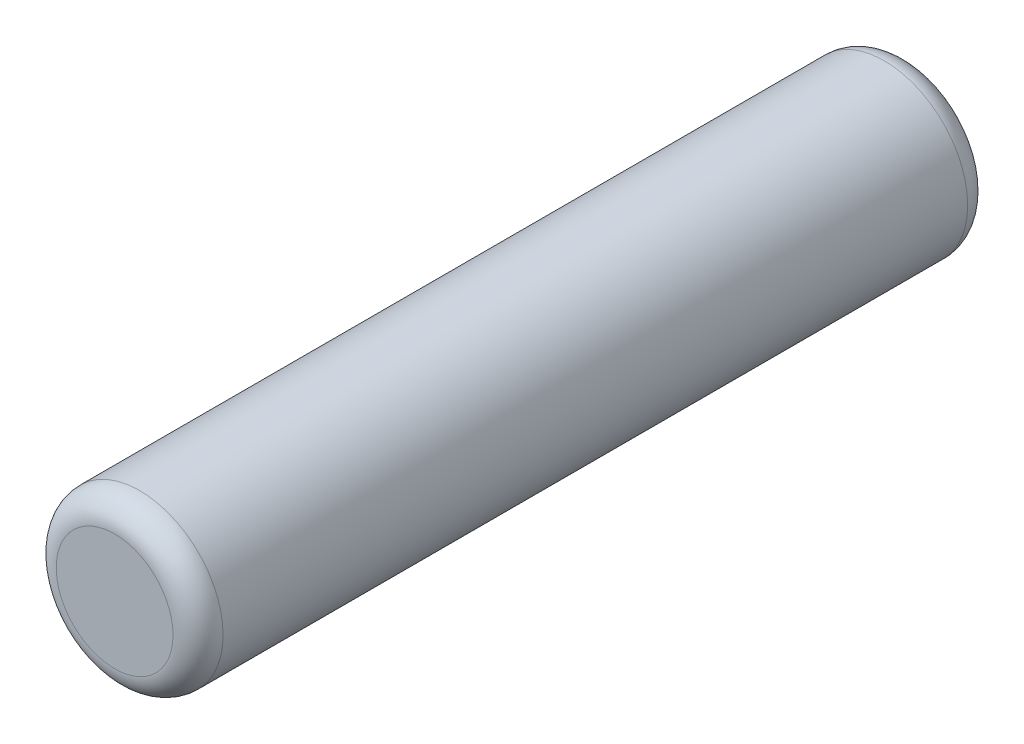
ISO-10303-21;
HEADER;
FILE_DESCRIPTION(('STEP AP214'),'2;1');
FILE_NAME('part.step','',(''),(''),'','','');
FILE_SCHEMA(('AUTOMOTIVE_DESIGN { 1 0 10303 214 1 1 1 1 }'));
ENDSEC;
DATA;
#1=APPLICATION_CONTEXT('core data for automotive mechanical design processes');
#2=APPLICATION_PROTOCOL_DEFINITION('international standard','automotive_design',2000,#1);
#3=PRODUCT_CONTEXT('',#1,'mechanical');
#4=PRODUCT('Part','Part','',(#3));
#5=PRODUCT_RELATED_PRODUCT_CATEGORY('part','',(#4));
#6=PRODUCT_DEFINITION_FORMATION('','',#4);
#7=PRODUCT_DEFINITION_CONTEXT('part definition',#1,'design');
#8=PRODUCT_DEFINITION('design','',#6,#7);
#9=PRODUCT_DEFINITION_SHAPE('','',#8);
#10=(LENGTH_UNIT() NAMED_UNIT(*) SI_UNIT(.MILLI.,.METRE.));
#11=(NAMED_UNIT(*) PLANE_ANGLE_UNIT() SI_UNIT($,.RADIAN.));
#12=(NAMED_UNIT(*) SI_UNIT($,.STERADIAN.) SOLID_ANGLE_UNIT());
#13=UNCERTAINTY_MEASURE_WITH_UNIT(LENGTH_MEASURE(1.E-05),#10,'distance_accuracy_value','');
#14=(GEOMETRIC_REPRESENTATION_CONTEXT(3) GLOBAL_UNCERTAINTY_ASSIGNED_CONTEXT((#13)) GLOBAL_UNIT_ASSIGNED_CONTEXT((#10,
#11,#12)) REPRESENTATION_CONTEXT('',''));
#15=CARTESIAN_POINT('',(0.,0.,0.));
#16=DIRECTION('',(0.,0.,1.));
#17=DIRECTION('',(1.,0.,0.));
#18=AXIS2_PLACEMENT_3D('',#15,#16,#17);
#19=CARTESIAN_POINT('',(0.,0.,-4.7625));
#20=DIRECTION('',(0.,0.,1.));
#21=DIRECTION('',(1.,0.,0.));
#22=AXIS2_PLACEMENT_3D('',#19,#20,#21);
#23=PLANE('',#22);
#24=CARTESIAN_POINT('',(0.,0.,-4.7625));
#25=DIRECTION('',(0.,0.,1.));
#26=DIRECTION('',(0.,-1.,0.));
#27=AXIS2_PLACEMENT_3D('',#24,#25,#26);
#28=CIRCLE('',#27,0.700000000000001);
#29=CARTESIAN_POINT('',(0.,-0.700000000000002,-4.7625));
#30=VERTEX_POINT('',#29);
#31=EDGE_CURVE('E36',#30,#30,#28,.T.);
#32=ORIENTED_EDGE('',*,*,#31,.F.);
#33=EDGE_LOOP('',(#32));
#34=FACE_BOUND('',#33,.T.);
#35=ADVANCED_FACE('F16',(#34),#23,.F.);
#36=CARTESIAN_POINT('',(0.,0.,4.7625));
#37=DIRECTION('',(0.,0.,1.));
#38=DIRECTION('',(1.,0.,0.));
#39=AXIS2_PLACEMENT_3D('',#36,#37,#38);
#40=PLANE('',#39);
#41=DIRECTION('',(0.0083225900761891,0.999965366647477,0.));
#42=VECTOR('',#41,1.);
#43=CARTESIAN_POINT('',(0.699909560659538,-0.0108663537933372,4.7625));
#44=LINE('',#43,#42);
#45=CARTESIAN_POINT('',(0.699912606396434,-0.0108664056507162,4.7625));
#46=VERTEX_POINT('',#45);
#47=CARTESIAN_POINT('',(0.7,0.,4.7625));
#48=VERTEX_POINT('',#47);
#49=EDGE_CURVE('E20',#46,#48,#44,.T.);
#50=ORIENTED_EDGE('',*,*,#49,.T.);
#51=CARTESIAN_POINT('',(0.,0.,4.7625));
#52=DIRECTION('',(0.,0.,1.));
#53=DIRECTION('',(1.,0.,0.));
#54=AXIS2_PLACEMENT_3D('',#51,#52,#53);
#55=CIRCLE('',#54,0.7);
#56=EDGE_CURVE('E32',#46,#48,#55,.F.);
#57=ORIENTED_EDGE('',*,*,#56,.F.);
#58=EDGE_LOOP('',(#50,#57));
#59=FACE_BOUND('',#58,.T.);
#60=ADVANCED_FACE('F34',(#59),#40,.T.);
#61=CARTESIAN_POINT('',(0.,0.,-4.4625));
#62=DIRECTION('',(0.,0.,1.));
#63=DIRECTION('',(0.,-1.,0.));
#64=AXIS2_PLACEMENT_3D('',#61,#62,#63);
#65=TOROIDAL_SURFACE('',#64,0.700000000000001,0.3);
#66=ORIENTED_EDGE('',*,*,#31,.T.);
#67=EDGE_LOOP('',(#66));
#68=FACE_BOUND('',#67,.T.);
#69=CARTESIAN_POINT('',(0.,0.,-4.4625));
#70=DIRECTION('',(0.,0.,1.));
#71=DIRECTION('',(1.,0.,0.));
#72=AXIS2_PLACEMENT_3D('',#69,#70,#71);
#73=CIRCLE('',#72,1.);
#74=CARTESIAN_POINT('',(1.,0.,-4.4625));
#75=VERTEX_POINT('',#74);
#76=EDGE_CURVE('E26',#75,#75,#73,.T.);
#77=ORIENTED_EDGE('',*,*,#76,.F.);
#78=EDGE_LOOP('',(#77));
#79=FACE_BOUND('',#78,.T.);
#80=ADVANCED_FACE('F48',(#68,#79),#65,.T.);
#81=CARTESIAN_POINT('',(0.,0.,4.4625));
#82=DIRECTION('',(0.,0.,1.));
#83=DIRECTION('',(1.,0.,0.));
#84=AXIS2_PLACEMENT_3D('',#81,#82,#83);
#85=TOROIDAL_SURFACE('',#84,0.7,0.3);
#86=ORIENTED_EDGE('',*,*,#49,.F.);
#87=ORIENTED_EDGE('',*,*,#56,.T.);
#88=EDGE_LOOP('',(#86,#87));
#89=FACE_BOUND('',#88,.T.);
#90=CARTESIAN_POINT('',(0.,0.,4.4625));
#91=DIRECTION('',(0.,0.,1.));
#92=DIRECTION('',(1.,0.,0.));
#93=AXIS2_PLACEMENT_3D('',#90,#91,#92);
#94=CIRCLE('',#93,1.);
#95=CARTESIAN_POINT('',(1.,0.,4.4625));
#96=VERTEX_POINT('',#95);
#97=EDGE_CURVE('E11',#96,#96,#94,.F.);
#98=ORIENTED_EDGE('',*,*,#97,.F.);
#99=EDGE_LOOP('',(#98));
#100=FACE_BOUND('',#99,.T.);
#101=ADVANCED_FACE('F18',(#89,#100),#85,.T.);
#102=CARTESIAN_POINT('',(0.,0.,4.7625));
#103=DIRECTION('',(0.,0.,1.));
#104=DIRECTION('',(1.,0.,0.));
#105=AXIS2_PLACEMENT_3D('',#102,#103,#104);
#106=CYLINDRICAL_SURFACE('',#105,1.);
#107=ORIENTED_EDGE('',*,*,#97,.T.);
#108=EDGE_LOOP('',(#107));
#109=FACE_BOUND('',#108,.T.);
#110=ORIENTED_EDGE('',*,*,#76,.T.);
#111=EDGE_LOOP('',(#110));
#112=FACE_BOUND('',#111,.T.);
#113=ADVANCED_FACE('F58',(#109,#112),#106,.T.);
#114=CLOSED_SHELL('',(#35,#60,#80,#101,#113));
#115=MANIFOLD_SOLID_BREP('B1',#114);
#116=ADVANCED_BREP_SHAPE_REPRESENTATION('',(#18,#115),#14);
#117=SHAPE_DEFINITION_REPRESENTATION(#9,#116);
ENDSEC;
END-ISO-10303-21;
